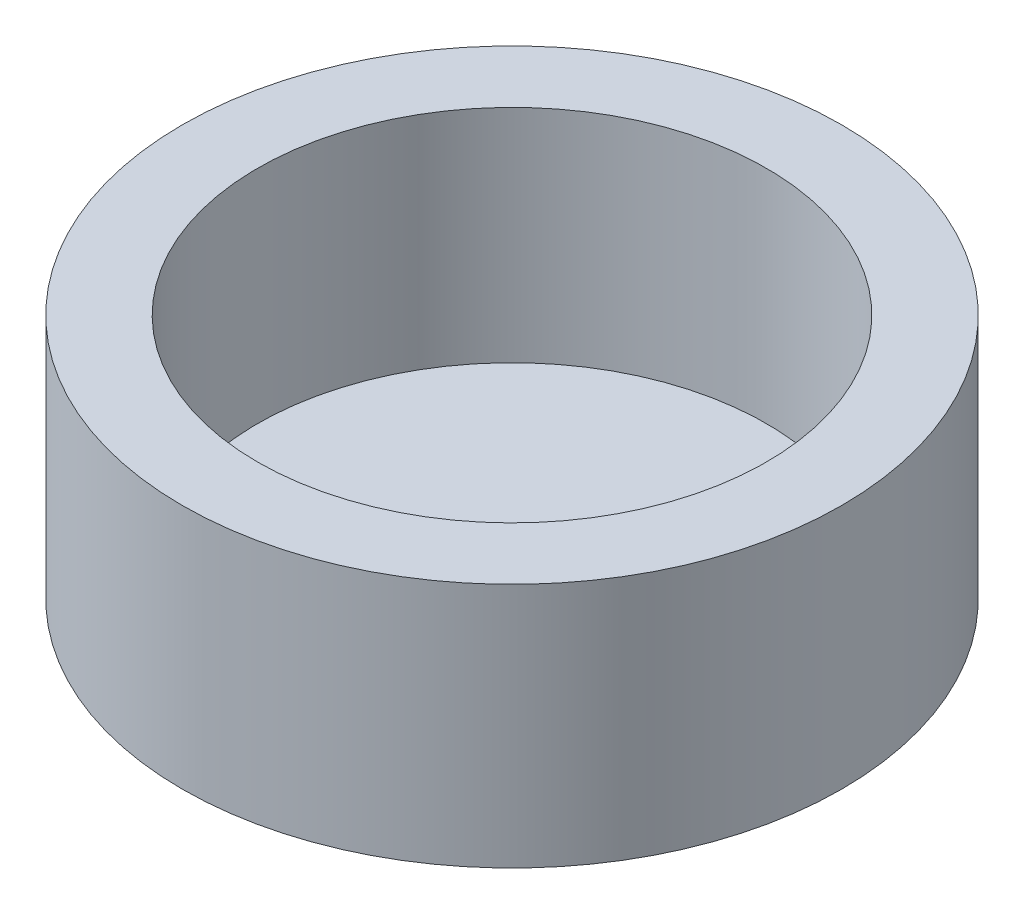
ISO-10303-21;
HEADER;
FILE_DESCRIPTION(('STEP AP214'),'2;1');
FILE_NAME('part.step','',(''),(''),'','','');
FILE_SCHEMA(('AUTOMOTIVE_DESIGN { 1 0 10303 214 1 1 1 1 }'));
ENDSEC;
DATA;
#1=APPLICATION_CONTEXT('core data for automotive mechanical design processes');
#2=APPLICATION_PROTOCOL_DEFINITION('international standard','automotive_design',2000,#1);
#3=PRODUCT_CONTEXT('',#1,'mechanical');
#4=PRODUCT('Part','Part','',(#3));
#5=PRODUCT_RELATED_PRODUCT_CATEGORY('part','',(#4));
#6=PRODUCT_DEFINITION_FORMATION('','',#4);
#7=PRODUCT_DEFINITION_CONTEXT('part definition',#1,'design');
#8=PRODUCT_DEFINITION('design','',#6,#7);
#9=PRODUCT_DEFINITION_SHAPE('','',#8);
#10=(LENGTH_UNIT() NAMED_UNIT(*) SI_UNIT(.MILLI.,.METRE.));
#11=(NAMED_UNIT(*) PLANE_ANGLE_UNIT() SI_UNIT($,.RADIAN.));
#12=(NAMED_UNIT(*) SI_UNIT($,.STERADIAN.) SOLID_ANGLE_UNIT());
#13=UNCERTAINTY_MEASURE_WITH_UNIT(LENGTH_MEASURE(1.E-05),#10,'distance_accuracy_value','');
#14=(GEOMETRIC_REPRESENTATION_CONTEXT(3) GLOBAL_UNCERTAINTY_ASSIGNED_CONTEXT((#13)) GLOBAL_UNIT_ASSIGNED_CONTEXT((#10,
#11,#12)) REPRESENTATION_CONTEXT('',''));
#15=CARTESIAN_POINT('',(0.,0.,0.));
#16=DIRECTION('',(0.,0.,1.));
#17=DIRECTION('',(1.,0.,0.));
#18=AXIS2_PLACEMENT_3D('',#15,#16,#17);
#19=CARTESIAN_POINT('',(0.,20.,0.));
#20=DIRECTION('',(0.,-1.,0.));
#21=DIRECTION('',(0.,0.,-1.));
#22=AXIS2_PLACEMENT_3D('',#19,#20,#21);
#23=CYLINDRICAL_SURFACE('',#22,26.8365878725591);
#24=CARTESIAN_POINT('',(0.,20.,0.));
#25=DIRECTION('',(0.,1.,0.));
#26=DIRECTION('',(0.,0.,1.));
#27=AXIS2_PLACEMENT_3D('',#24,#25,#26);
#28=CIRCLE('',#27,26.8365878725591);
#29=CARTESIAN_POINT('',(0.,20.,26.8365878725591));
#30=VERTEX_POINT('',#29);
#31=EDGE_CURVE('E10',#30,#30,#28,.T.);
#32=ORIENTED_EDGE('',*,*,#31,.F.);
#33=EDGE_LOOP('',(#32));
#34=FACE_BOUND('',#33,.T.);
#35=CARTESIAN_POINT('',(0.,0.,0.));
#36=DIRECTION('',(0.,1.,0.));
#37=DIRECTION('',(0.,0.,1.));
#38=AXIS2_PLACEMENT_3D('',#35,#36,#37);
#39=CIRCLE('',#38,26.8365878725591);
#40=CARTESIAN_POINT('',(0.,0.,26.8365878725591));
#41=VERTEX_POINT('',#40);
#42=EDGE_CURVE('E40',#41,#41,#39,.T.);
#43=ORIENTED_EDGE('',*,*,#42,.T.);
#44=EDGE_LOOP('',(#43));
#45=FACE_BOUND('',#44,.T.);
#46=ADVANCED_FACE('F37',(#34,#45),#23,.T.);
#47=CARTESIAN_POINT('',(0.,20.,0.));
#48=DIRECTION('',(0.,1.,0.));
#49=DIRECTION('',(0.,0.,1.));
#50=AXIS2_PLACEMENT_3D('',#47,#48,#49);
#51=PLANE('',#50);
#52=CARTESIAN_POINT('',(0.,20.,0.));
#53=DIRECTION('',(0.,1.,0.));
#54=DIRECTION('',(0.,0.,1.));
#55=AXIS2_PLACEMENT_3D('',#52,#53,#54);
#56=CIRCLE('',#55,20.7116232912025);
#57=CARTESIAN_POINT('',(0.,20.,20.7116232912025));
#58=VERTEX_POINT('',#57);
#59=EDGE_CURVE('E51',#58,#58,#56,.T.);
#60=ORIENTED_EDGE('',*,*,#59,.F.);
#61=EDGE_LOOP('',(#60));
#62=FACE_BOUND('',#61,.T.);
#63=ORIENTED_EDGE('',*,*,#31,.T.);
#64=EDGE_LOOP('',(#63));
#65=FACE_BOUND('',#64,.T.);
#66=ADVANCED_FACE('F68',(#62,#65),#51,.T.);
#67=CARTESIAN_POINT('',(0.,0.,0.));
#68=DIRECTION('',(0.,1.,0.));
#69=DIRECTION('',(0.,0.,1.));
#70=AXIS2_PLACEMENT_3D('',#67,#68,#69);
#71=PLANE('',#70);
#72=ORIENTED_EDGE('',*,*,#42,.F.);
#73=EDGE_LOOP('',(#72));
#74=FACE_BOUND('',#73,.T.);
#75=ADVANCED_FACE('F64',(#74),#71,.F.);
#76=CARTESIAN_POINT('',(0.,1.99999999999999,0.));
#77=DIRECTION('',(0.,1.,0.));
#78=DIRECTION('',(0.,0.,1.));
#79=AXIS2_PLACEMENT_3D('',#76,#77,#78);
#80=CYLINDRICAL_SURFACE('',#79,20.7116232912025);
#81=CARTESIAN_POINT('',(0.,1.99999999999999,0.));
#82=DIRECTION('',(0.,1.,0.));
#83=DIRECTION('',(0.,0.,1.));
#84=AXIS2_PLACEMENT_3D('',#81,#82,#83);
#85=CIRCLE('',#84,20.7116232912025);
#86=CARTESIAN_POINT('',(0.,1.99999999999999,20.7116232912025));
#87=VERTEX_POINT('',#86);
#88=EDGE_CURVE('E49',#87,#87,#85,.T.);
#89=ORIENTED_EDGE('',*,*,#88,.F.);
#90=EDGE_LOOP('',(#89));
#91=FACE_BOUND('',#90,.T.);
#92=ORIENTED_EDGE('',*,*,#59,.T.);
#93=EDGE_LOOP('',(#92));
#94=FACE_BOUND('',#93,.T.);
#95=ADVANCED_FACE('F61',(#91,#94),#80,.F.);
#96=CARTESIAN_POINT('',(0.,1.99999999999999,0.));
#97=DIRECTION('',(0.,1.,0.));
#98=DIRECTION('',(0.,0.,1.));
#99=AXIS2_PLACEMENT_3D('',#96,#97,#98);
#100=PLANE('',#99);
#101=ORIENTED_EDGE('',*,*,#88,.T.);
#102=EDGE_LOOP('',(#101));
#103=FACE_BOUND('',#102,.T.);
#104=ADVANCED_FACE('F59',(#103),#100,.T.);
#105=CLOSED_SHELL('',(#46,#66,#75,#95,#104));
#106=MANIFOLD_SOLID_BREP('B2',#105);
#107=ADVANCED_BREP_SHAPE_REPRESENTATION('',(#18,#106),#14);
#108=SHAPE_DEFINITION_REPRESENTATION(#9,#107);
ENDSEC;
END-ISO-10303-21;
